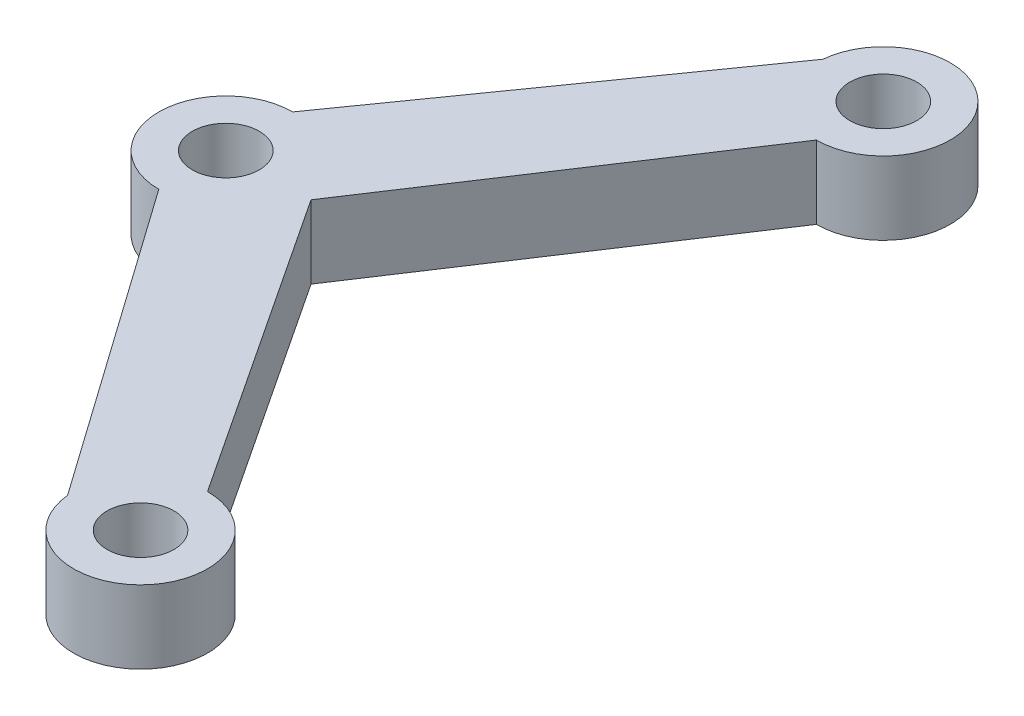
ISO-10303-21;
HEADER;
FILE_DESCRIPTION(('STEP AP214'),'2;1');
FILE_NAME('part.step','',(''),(''),'','','');
FILE_SCHEMA(('AUTOMOTIVE_DESIGN { 1 0 10303 214 1 1 1 1 }'));
ENDSEC;
DATA;
#1=APPLICATION_CONTEXT('core data for automotive mechanical design processes');
#2=APPLICATION_PROTOCOL_DEFINITION('international standard','automotive_design',2000,#1);
#3=PRODUCT_CONTEXT('',#1,'mechanical');
#4=PRODUCT('Part','Part','',(#3));
#5=PRODUCT_RELATED_PRODUCT_CATEGORY('part','',(#4));
#6=PRODUCT_DEFINITION_FORMATION('','',#4);
#7=PRODUCT_DEFINITION_CONTEXT('part definition',#1,'design');
#8=PRODUCT_DEFINITION('design','',#6,#7);
#9=PRODUCT_DEFINITION_SHAPE('','',#8);
#10=(LENGTH_UNIT() NAMED_UNIT(*) SI_UNIT(.MILLI.,.METRE.));
#11=(NAMED_UNIT(*) PLANE_ANGLE_UNIT() SI_UNIT($,.RADIAN.));
#12=(NAMED_UNIT(*) SI_UNIT($,.STERADIAN.) SOLID_ANGLE_UNIT());
#13=UNCERTAINTY_MEASURE_WITH_UNIT(LENGTH_MEASURE(1.E-05),#10,'distance_accuracy_value','');
#14=(GEOMETRIC_REPRESENTATION_CONTEXT(3) GLOBAL_UNCERTAINTY_ASSIGNED_CONTEXT((#13)) GLOBAL_UNIT_ASSIGNED_CONTEXT((#10,
#11,#12)) REPRESENTATION_CONTEXT('',''));
#15=CARTESIAN_POINT('',(0.,0.,0.));
#16=DIRECTION('',(0.,0.,1.));
#17=DIRECTION('',(1.,0.,0.));
#18=AXIS2_PLACEMENT_3D('',#15,#16,#17);
#19=CARTESIAN_POINT('',(-15.25,3.,15.25));
#20=DIRECTION('',(0.,1.,0.));
#21=DIRECTION('',(0.,0.,1.));
#22=AXIS2_PLACEMENT_3D('',#19,#20,#21);
#23=PLANE('',#22);
#24=CARTESIAN_POINT('',(-27.,3.,0.));
#25=DIRECTION('',(0.,1.,0.));
#26=DIRECTION('',(0.,0.,1.));
#27=AXIS2_PLACEMENT_3D('',#24,#25,#26);
#28=CIRCLE('',#27,1.375);
#29=CARTESIAN_POINT('',(-27.,3.,1.375));
#30=VERTEX_POINT('',#29);
#31=EDGE_CURVE('E170',#30,#30,#28,.T.);
#32=ORIENTED_EDGE('',*,*,#31,.F.);
#33=EDGE_LOOP('',(#32));
#34=FACE_BOUND('',#33,.T.);
#35=CARTESIAN_POINT('',(-15.25,3.,15.25));
#36=DIRECTION('',(0.,1.,0.));
#37=DIRECTION('',(0.,0.,1.));
#38=AXIS2_PLACEMENT_3D('',#35,#36,#37);
#39=CIRCLE('',#38,2.75);
#40=CARTESIAN_POINT('',(-17.9877734334544,3.,15.5090301663348));
#41=VERTEX_POINT('',#40);
#42=CARTESIAN_POINT('',(-15.25,3.,12.5));
#43=VERTEX_POINT('',#42);
#44=EDGE_CURVE('E143',#41,#43,#39,.T.);
#45=ORIENTED_EDGE('',*,*,#44,.T.);
#46=DIRECTION('',(-0.550842208330739,0.,-0.834609406561725));
#47=VECTOR('',#46,1.);
#48=CARTESIAN_POINT('',(-15.25,3.,12.5));
#49=LINE('',#48,#47);
#50=CARTESIAN_POINT('',(-23.5,3.,0.));
#51=VERTEX_POINT('',#50);
#52=EDGE_CURVE('E96',#43,#51,#49,.T.);
#53=ORIENTED_EDGE('',*,*,#52,.T.);
#54=DIRECTION('',(0.550842208330739,0.,-0.834609406561725));
#55=VECTOR('',#54,1.);
#56=CARTESIAN_POINT('',(-15.25,3.,-12.5));
#57=LINE('',#56,#55);
#58=CARTESIAN_POINT('',(-15.25,3.,-12.5));
#59=VERTEX_POINT('',#58);
#60=EDGE_CURVE('E155',#51,#59,#57,.T.);
#61=ORIENTED_EDGE('',*,*,#60,.T.);
#62=CARTESIAN_POINT('',(-15.25,3.,-15.25));
#63=DIRECTION('',(0.,1.,0.));
#64=DIRECTION('',(0.,0.,1.));
#65=AXIS2_PLACEMENT_3D('',#62,#63,#64);
#66=CIRCLE('',#65,2.75);
#67=CARTESIAN_POINT('',(-17.9877734334544,3.,-15.5090301663348));
#68=VERTEX_POINT('',#67);
#69=EDGE_CURVE('E112',#59,#68,#66,.T.);
#70=ORIENTED_EDGE('',*,*,#69,.T.);
#71=DIRECTION('',(-0.57693322372587,0.,0.8167913168988));
#72=VECTOR('',#71,1.);
#73=CARTESIAN_POINT('',(-17.9877734334544,3.,-15.5090301663348));
#74=LINE('',#73,#72);
#75=CARTESIAN_POINT('',(-27.,3.,-2.75));
#76=VERTEX_POINT('',#75);
#77=EDGE_CURVE('E106',#68,#76,#74,.T.);
#78=ORIENTED_EDGE('',*,*,#77,.T.);
#79=CARTESIAN_POINT('',(-27.,3.,0.));
#80=DIRECTION('',(0.,1.,0.));
#81=DIRECTION('',(0.,0.,1.));
#82=AXIS2_PLACEMENT_3D('',#79,#80,#81);
#83=CIRCLE('',#82,2.75);
#84=CARTESIAN_POINT('',(-27.,3.,2.75));
#85=VERTEX_POINT('',#84);
#86=EDGE_CURVE('E110',#76,#85,#83,.T.);
#87=ORIENTED_EDGE('',*,*,#86,.T.);
#88=DIRECTION('',(0.57693322372587,0.,0.8167913168988));
#89=VECTOR('',#88,1.);
#90=CARTESIAN_POINT('',(-27.,3.,2.75));
#91=LINE('',#90,#89);
#92=EDGE_CURVE('E56',#85,#41,#91,.T.);
#93=ORIENTED_EDGE('',*,*,#92,.T.);
#94=EDGE_LOOP('',(#45,#53,#61,#70,#78,#87,#93));
#95=FACE_BOUND('',#94,.T.);
#96=CARTESIAN_POINT('',(-15.25,3.,-15.25));
#97=DIRECTION('',(0.,1.,0.));
#98=DIRECTION('',(0.,0.,1.));
#99=AXIS2_PLACEMENT_3D('',#96,#97,#98);
#100=CIRCLE('',#99,1.375);
#101=CARTESIAN_POINT('',(-15.25,3.,-13.875));
#102=VERTEX_POINT('',#101);
#103=EDGE_CURVE('E134',#102,#102,#100,.T.);
#104=ORIENTED_EDGE('',*,*,#103,.F.);
#105=EDGE_LOOP('',(#104));
#106=FACE_BOUND('',#105,.T.);
#107=CARTESIAN_POINT('',(-15.25,3.,15.25));
#108=DIRECTION('',(0.,1.,0.));
#109=DIRECTION('',(0.,0.,1.));
#110=AXIS2_PLACEMENT_3D('',#107,#108,#109);
#111=CIRCLE('',#110,1.375);
#112=CARTESIAN_POINT('',(-15.25,3.,16.625));
#113=VERTEX_POINT('',#112);
#114=EDGE_CURVE('E176',#113,#113,#111,.T.);
#115=ORIENTED_EDGE('',*,*,#114,.F.);
#116=EDGE_LOOP('',(#115));
#117=FACE_BOUND('',#116,.T.);
#118=ADVANCED_FACE('F39',(#34,#95,#106,#117),#23,.T.);
#119=CARTESIAN_POINT('',(-15.25,0.,15.25));
#120=DIRECTION('',(0.,1.,0.));
#121=DIRECTION('',(0.,0.,1.));
#122=AXIS2_PLACEMENT_3D('',#119,#120,#121);
#123=PLANE('',#122);
#124=CARTESIAN_POINT('',(-15.25,0.,15.25));
#125=DIRECTION('',(0.,1.,0.));
#126=DIRECTION('',(0.,0.,1.));
#127=AXIS2_PLACEMENT_3D('',#124,#125,#126);
#128=CIRCLE('',#127,2.75);
#129=CARTESIAN_POINT('',(-17.9877734334544,0.,15.5090301663348));
#130=VERTEX_POINT('',#129);
#131=CARTESIAN_POINT('',(-15.25,0.,12.5));
#132=VERTEX_POINT('',#131);
#133=EDGE_CURVE('E130',#130,#132,#128,.T.);
#134=ORIENTED_EDGE('',*,*,#133,.F.);
#135=DIRECTION('',(0.57693322372587,0.,0.8167913168988));
#136=VECTOR('',#135,1.);
#137=CARTESIAN_POINT('',(-27.,0.,2.75));
#138=LINE('',#137,#136);
#139=CARTESIAN_POINT('',(-27.,0.,2.75));
#140=VERTEX_POINT('',#139);
#141=EDGE_CURVE('E88',#140,#130,#138,.T.);
#142=ORIENTED_EDGE('',*,*,#141,.F.);
#143=CARTESIAN_POINT('',(-27.,0.,0.));
#144=DIRECTION('',(0.,1.,0.));
#145=DIRECTION('',(0.,0.,1.));
#146=AXIS2_PLACEMENT_3D('',#143,#144,#145);
#147=CIRCLE('',#146,2.75);
#148=CARTESIAN_POINT('',(-27.,0.,-2.75));
#149=VERTEX_POINT('',#148);
#150=EDGE_CURVE('E82',#149,#140,#147,.T.);
#151=ORIENTED_EDGE('',*,*,#150,.F.);
#152=DIRECTION('',(-0.57693322372587,0.,0.8167913168988));
#153=VECTOR('',#152,1.);
#154=CARTESIAN_POINT('',(-17.9877734334544,0.,-15.5090301663348));
#155=LINE('',#154,#153);
#156=CARTESIAN_POINT('',(-17.9877734334544,0.,-15.5090301663348));
#157=VERTEX_POINT('',#156);
#158=EDGE_CURVE('E120',#157,#149,#155,.T.);
#159=ORIENTED_EDGE('',*,*,#158,.F.);
#160=CARTESIAN_POINT('',(-15.25,0.,-15.25));
#161=DIRECTION('',(0.,1.,0.));
#162=DIRECTION('',(0.,0.,1.));
#163=AXIS2_PLACEMENT_3D('',#160,#161,#162);
#164=CIRCLE('',#163,2.75);
#165=CARTESIAN_POINT('',(-15.25,0.,-12.5));
#166=VERTEX_POINT('',#165);
#167=EDGE_CURVE('E138',#166,#157,#164,.T.);
#168=ORIENTED_EDGE('',*,*,#167,.F.);
#169=DIRECTION('',(0.550842208330739,0.,-0.834609406561725));
#170=VECTOR('',#169,1.);
#171=CARTESIAN_POINT('',(-15.25,0.,-12.5));
#172=LINE('',#171,#170);
#173=CARTESIAN_POINT('',(-23.5,0.,0.));
#174=VERTEX_POINT('',#173);
#175=EDGE_CURVE('E136',#174,#166,#172,.T.);
#176=ORIENTED_EDGE('',*,*,#175,.F.);
#177=DIRECTION('',(-0.550842208330739,0.,-0.834609406561725));
#178=VECTOR('',#177,1.);
#179=CARTESIAN_POINT('',(-15.25,0.,12.5));
#180=LINE('',#179,#178);
#181=EDGE_CURVE('E133',#132,#174,#180,.T.);
#182=ORIENTED_EDGE('',*,*,#181,.F.);
#183=EDGE_LOOP('',(#134,#142,#151,#159,#168,#176,#182));
#184=FACE_BOUND('',#183,.T.);
#185=CARTESIAN_POINT('',(-15.25,0.,-15.25));
#186=DIRECTION('',(0.,1.,0.));
#187=DIRECTION('',(0.,0.,1.));
#188=AXIS2_PLACEMENT_3D('',#185,#186,#187);
#189=CIRCLE('',#188,1.375);
#190=CARTESIAN_POINT('',(-15.25,0.,-13.875));
#191=VERTEX_POINT('',#190);
#192=EDGE_CURVE('E167',#191,#191,#189,.T.);
#193=ORIENTED_EDGE('',*,*,#192,.T.);
#194=EDGE_LOOP('',(#193));
#195=FACE_BOUND('',#194,.T.);
#196=CARTESIAN_POINT('',(-27.,0.,0.));
#197=DIRECTION('',(0.,1.,0.));
#198=DIRECTION('',(0.,0.,1.));
#199=AXIS2_PLACEMENT_3D('',#196,#197,#198);
#200=CIRCLE('',#199,1.375);
#201=CARTESIAN_POINT('',(-27.,0.,1.375));
#202=VERTEX_POINT('',#201);
#203=EDGE_CURVE('E173',#202,#202,#200,.T.);
#204=ORIENTED_EDGE('',*,*,#203,.T.);
#205=EDGE_LOOP('',(#204));
#206=FACE_BOUND('',#205,.T.);
#207=CARTESIAN_POINT('',(-15.25,0.,15.25));
#208=DIRECTION('',(0.,1.,0.));
#209=DIRECTION('',(0.,0.,1.));
#210=AXIS2_PLACEMENT_3D('',#207,#208,#209);
#211=CIRCLE('',#210,1.375);
#212=CARTESIAN_POINT('',(-15.25,0.,16.625));
#213=VERTEX_POINT('',#212);
#214=EDGE_CURVE('E179',#213,#213,#211,.T.);
#215=ORIENTED_EDGE('',*,*,#214,.T.);
#216=EDGE_LOOP('',(#215));
#217=FACE_BOUND('',#216,.T.);
#218=ADVANCED_FACE('F159',(#184,#195,#206,#217),#123,.F.);
#219=CARTESIAN_POINT('',(-15.25,3.,15.25));
#220=DIRECTION('',(0.,-1.,0.));
#221=DIRECTION('',(0.,0.,-1.));
#222=AXIS2_PLACEMENT_3D('',#219,#220,#221);
#223=CYLINDRICAL_SURFACE('',#222,2.75);
#224=ORIENTED_EDGE('',*,*,#133,.T.);
#225=DIRECTION('',(0.,-1.,0.));
#226=VECTOR('',#225,1.);
#227=CARTESIAN_POINT('',(-15.25,3.,12.5));
#228=LINE('',#227,#226);
#229=EDGE_CURVE('E11',#43,#132,#228,.T.);
#230=ORIENTED_EDGE('',*,*,#229,.F.);
#231=ORIENTED_EDGE('',*,*,#44,.F.);
#232=DIRECTION('',(0.,-1.,0.));
#233=VECTOR('',#232,1.);
#234=CARTESIAN_POINT('',(-17.9877734334544,3.,15.5090301663348));
#235=LINE('',#234,#233);
#236=EDGE_CURVE('E126',#41,#130,#235,.T.);
#237=ORIENTED_EDGE('',*,*,#236,.T.);
#238=EDGE_LOOP('',(#224,#230,#231,#237));
#239=FACE_BOUND('',#238,.T.);
#240=ADVANCED_FACE('F41',(#239),#223,.T.);
#241=CARTESIAN_POINT('',(-15.25,3.,12.5));
#242=DIRECTION('',(-0.834609406561725,0.,0.550842208330739));
#243=DIRECTION('',(0.550842208330739,0.,0.834609406561725));
#244=AXIS2_PLACEMENT_3D('',#241,#242,#243);
#245=PLANE('',#244);
#246=ORIENTED_EDGE('',*,*,#181,.T.);
#247=DIRECTION('',(0.,-1.,0.));
#248=VECTOR('',#247,1.);
#249=CARTESIAN_POINT('',(-23.5,3.,0.));
#250=LINE('',#249,#248);
#251=EDGE_CURVE('E48',#51,#174,#250,.T.);
#252=ORIENTED_EDGE('',*,*,#251,.F.);
#253=ORIENTED_EDGE('',*,*,#52,.F.);
#254=ORIENTED_EDGE('',*,*,#229,.T.);
#255=EDGE_LOOP('',(#246,#252,#253,#254));
#256=FACE_BOUND('',#255,.T.);
#257=ADVANCED_FACE('F210',(#256),#245,.F.);
#258=CARTESIAN_POINT('',(-15.25,3.,-12.5));
#259=DIRECTION('',(-0.834609406561725,0.,-0.550842208330739));
#260=DIRECTION('',(-0.550842208330739,0.,0.834609406561725));
#261=AXIS2_PLACEMENT_3D('',#258,#259,#260);
#262=PLANE('',#261);
#263=ORIENTED_EDGE('',*,*,#175,.T.);
#264=DIRECTION('',(0.,-1.,0.));
#265=VECTOR('',#264,1.);
#266=CARTESIAN_POINT('',(-15.25,3.,-12.5));
#267=LINE('',#266,#265);
#268=EDGE_CURVE('E147',#59,#166,#267,.T.);
#269=ORIENTED_EDGE('',*,*,#268,.F.);
#270=ORIENTED_EDGE('',*,*,#60,.F.);
#271=ORIENTED_EDGE('',*,*,#251,.T.);
#272=EDGE_LOOP('',(#263,#269,#270,#271));
#273=FACE_BOUND('',#272,.T.);
#274=ADVANCED_FACE('F153',(#273),#262,.F.);
#275=CARTESIAN_POINT('',(-15.25,3.,-15.25));
#276=DIRECTION('',(0.,-1.,0.));
#277=DIRECTION('',(0.,0.,-1.));
#278=AXIS2_PLACEMENT_3D('',#275,#276,#277);
#279=CYLINDRICAL_SURFACE('',#278,2.75);
#280=ORIENTED_EDGE('',*,*,#167,.T.);
#281=DIRECTION('',(0.,-1.,0.));
#282=VECTOR('',#281,1.);
#283=CARTESIAN_POINT('',(-17.9877734334544,3.,-15.5090301663348));
#284=LINE('',#283,#282);
#285=EDGE_CURVE('E121',#68,#157,#284,.T.);
#286=ORIENTED_EDGE('',*,*,#285,.F.);
#287=ORIENTED_EDGE('',*,*,#69,.F.);
#288=ORIENTED_EDGE('',*,*,#268,.T.);
#289=EDGE_LOOP('',(#280,#286,#287,#288));
#290=FACE_BOUND('',#289,.T.);
#291=ADVANCED_FACE('F162',(#290),#279,.T.);
#292=CARTESIAN_POINT('',(-17.9877734334544,3.,-15.5090301663348));
#293=DIRECTION('',(0.8167913168988,0.,0.57693322372587));
#294=DIRECTION('',(0.57693322372587,0.,-0.8167913168988));
#295=AXIS2_PLACEMENT_3D('',#292,#293,#294);
#296=PLANE('',#295);
#297=ORIENTED_EDGE('',*,*,#158,.T.);
#298=DIRECTION('',(0.,-1.,0.));
#299=VECTOR('',#298,1.);
#300=CARTESIAN_POINT('',(-27.,3.,-2.75));
#301=LINE('',#300,#299);
#302=EDGE_CURVE('E117',#76,#149,#301,.T.);
#303=ORIENTED_EDGE('',*,*,#302,.F.);
#304=ORIENTED_EDGE('',*,*,#77,.F.);
#305=ORIENTED_EDGE('',*,*,#285,.T.);
#306=EDGE_LOOP('',(#297,#303,#304,#305));
#307=FACE_BOUND('',#306,.T.);
#308=ADVANCED_FACE('F118',(#307),#296,.F.);
#309=CARTESIAN_POINT('',(-27.,3.,0.));
#310=DIRECTION('',(0.,-1.,0.));
#311=DIRECTION('',(0.,0.,-1.));
#312=AXIS2_PLACEMENT_3D('',#309,#310,#311);
#313=CYLINDRICAL_SURFACE('',#312,2.75);
#314=ORIENTED_EDGE('',*,*,#150,.T.);
#315=DIRECTION('',(0.,-1.,0.));
#316=VECTOR('',#315,1.);
#317=CARTESIAN_POINT('',(-27.,3.,2.75));
#318=LINE('',#317,#316);
#319=EDGE_CURVE('E122',#85,#140,#318,.T.);
#320=ORIENTED_EDGE('',*,*,#319,.F.);
#321=ORIENTED_EDGE('',*,*,#86,.F.);
#322=ORIENTED_EDGE('',*,*,#302,.T.);
#323=EDGE_LOOP('',(#314,#320,#321,#322));
#324=FACE_BOUND('',#323,.T.);
#325=ADVANCED_FACE('F124',(#324),#313,.T.);
#326=CARTESIAN_POINT('',(-27.,3.,2.75));
#327=DIRECTION('',(0.8167913168988,0.,-0.57693322372587));
#328=DIRECTION('',(-0.57693322372587,0.,-0.8167913168988));
#329=AXIS2_PLACEMENT_3D('',#326,#327,#328);
#330=PLANE('',#329);
#331=ORIENTED_EDGE('',*,*,#141,.T.);
#332=ORIENTED_EDGE('',*,*,#236,.F.);
#333=ORIENTED_EDGE('',*,*,#92,.F.);
#334=ORIENTED_EDGE('',*,*,#319,.T.);
#335=EDGE_LOOP('',(#331,#332,#333,#334));
#336=FACE_BOUND('',#335,.T.);
#337=ADVANCED_FACE('F200',(#336),#330,.F.);
#338=CARTESIAN_POINT('',(-15.25,3.,-15.25));
#339=DIRECTION('',(0.,-1.,0.));
#340=DIRECTION('',(0.,0.,-1.));
#341=AXIS2_PLACEMENT_3D('',#338,#339,#340);
#342=CYLINDRICAL_SURFACE('',#341,1.375);
#343=ORIENTED_EDGE('',*,*,#103,.T.);
#344=EDGE_LOOP('',(#343));
#345=FACE_BOUND('',#344,.T.);
#346=ORIENTED_EDGE('',*,*,#192,.F.);
#347=EDGE_LOOP('',(#346));
#348=FACE_BOUND('',#347,.T.);
#349=ADVANCED_FACE('F197',(#345,#348),#342,.F.);
#350=CARTESIAN_POINT('',(-27.,3.,0.));
#351=DIRECTION('',(0.,-1.,0.));
#352=DIRECTION('',(0.,0.,-1.));
#353=AXIS2_PLACEMENT_3D('',#350,#351,#352);
#354=CYLINDRICAL_SURFACE('',#353,1.375);
#355=ORIENTED_EDGE('',*,*,#31,.T.);
#356=EDGE_LOOP('',(#355));
#357=FACE_BOUND('',#356,.T.);
#358=ORIENTED_EDGE('',*,*,#203,.F.);
#359=EDGE_LOOP('',(#358));
#360=FACE_BOUND('',#359,.T.);
#361=ADVANCED_FACE('F268',(#357,#360),#354,.F.);
#362=CARTESIAN_POINT('',(-15.25,3.,15.25));
#363=DIRECTION('',(0.,-1.,0.));
#364=DIRECTION('',(0.,0.,-1.));
#365=AXIS2_PLACEMENT_3D('',#362,#363,#364);
#366=CYLINDRICAL_SURFACE('',#365,1.375);
#367=ORIENTED_EDGE('',*,*,#114,.T.);
#368=EDGE_LOOP('',(#367));
#369=FACE_BOUND('',#368,.T.);
#370=ORIENTED_EDGE('',*,*,#214,.F.);
#371=EDGE_LOOP('',(#370));
#372=FACE_BOUND('',#371,.T.);
#373=ADVANCED_FACE('F185',(#369,#372),#366,.F.);
#374=CLOSED_SHELL('',(#118,#218,#240,#257,#274,#291,#308,#325,#337,#349,#361,#373));
#375=MANIFOLD_SOLID_BREP('B2',#374);
#376=ADVANCED_BREP_SHAPE_REPRESENTATION('',(#18,#375),#14);
#377=SHAPE_DEFINITION_REPRESENTATION(#9,#376);
ENDSEC;
END-ISO-10303-21;
